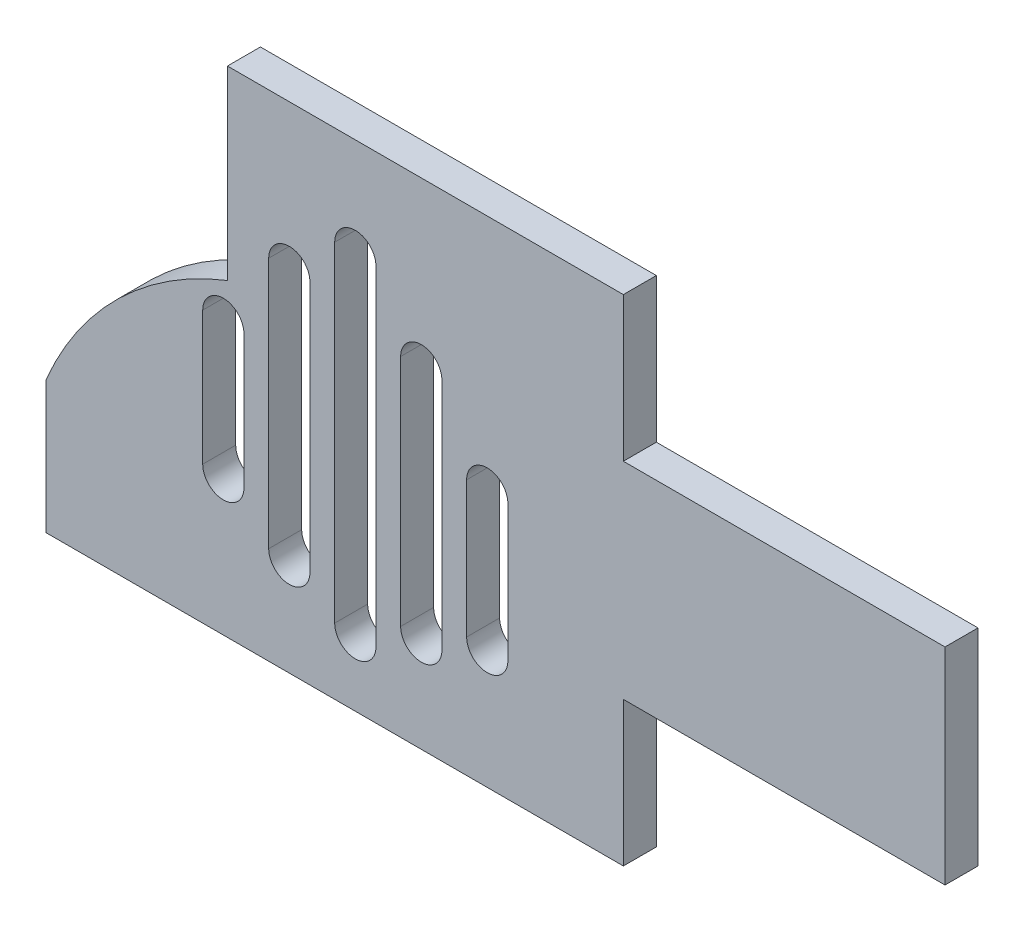
ISO-10303-21;
HEADER;
FILE_DESCRIPTION(('STEP AP214'),'2;1');
FILE_NAME('part.step','',(''),(''),'','','');
FILE_SCHEMA(('AUTOMOTIVE_DESIGN { 1 0 10303 214 1 1 1 1 }'));
ENDSEC;
DATA;
#1=APPLICATION_CONTEXT('core data for automotive mechanical design processes');
#2=APPLICATION_PROTOCOL_DEFINITION('international standard','automotive_design',2000,#1);
#3=PRODUCT_CONTEXT('',#1,'mechanical');
#4=PRODUCT('Part','Part','',(#3));
#5=PRODUCT_RELATED_PRODUCT_CATEGORY('part','',(#4));
#6=PRODUCT_DEFINITION_FORMATION('','',#4);
#7=PRODUCT_DEFINITION_CONTEXT('part definition',#1,'design');
#8=PRODUCT_DEFINITION('design','',#6,#7);
#9=PRODUCT_DEFINITION_SHAPE('','',#8);
#10=(LENGTH_UNIT() NAMED_UNIT(*) SI_UNIT(.MILLI.,.METRE.));
#11=(NAMED_UNIT(*) PLANE_ANGLE_UNIT() SI_UNIT($,.RADIAN.));
#12=(NAMED_UNIT(*) SI_UNIT($,.STERADIAN.) SOLID_ANGLE_UNIT());
#13=UNCERTAINTY_MEASURE_WITH_UNIT(LENGTH_MEASURE(1.E-05),#10,'distance_accuracy_value','');
#14=(GEOMETRIC_REPRESENTATION_CONTEXT(3) GLOBAL_UNCERTAINTY_ASSIGNED_CONTEXT((#13)) GLOBAL_UNIT_ASSIGNED_CONTEXT((#10,
#11,#12)) REPRESENTATION_CONTEXT('',''));
#15=CARTESIAN_POINT('',(0.,0.,0.));
#16=DIRECTION('',(0.,0.,1.));
#17=DIRECTION('',(1.,0.,0.));
#18=AXIS2_PLACEMENT_3D('',#15,#16,#17);
#19=CARTESIAN_POINT('',(-2.92778104034197,-8.11928736668815,4.));
#20=DIRECTION('',(0.,0.,1.));
#21=DIRECTION('',(1.,0.,0.));
#22=AXIS2_PLACEMENT_3D('',#19,#20,#21);
#23=PLANE('',#22);
#24=DIRECTION('',(1.,0.,0.));
#25=VECTOR('',#24,1.);
#26=CARTESIAN_POINT('',(30.8627181714712,-9.00594586937473,4.));
#27=LINE('',#26,#25);
#28=CARTESIAN_POINT('',(-39.1372818285288,-9.00594586937474,4.));
#29=VERTEX_POINT('',#28);
#30=CARTESIAN_POINT('',(30.8627181714712,-9.00594586937473,4.));
#31=VERTEX_POINT('',#30);
#32=EDGE_CURVE('E390',#29,#31,#27,.T.);
#33=ORIENTED_EDGE('',*,*,#32,.T.);
#34=DIRECTION('',(0.,1.,0.));
#35=VECTOR('',#34,1.);
#36=CARTESIAN_POINT('',(30.8627181714712,8.49405413062527,4.));
#37=LINE('',#36,#35);
#38=CARTESIAN_POINT('',(30.8627181714712,8.49405413062527,4.));
#39=VERTEX_POINT('',#38);
#40=EDGE_CURVE('E393',#31,#39,#37,.T.);
#41=ORIENTED_EDGE('',*,*,#40,.T.);
#42=DIRECTION('',(1.,0.,0.));
#43=VECTOR('',#42,1.);
#44=CARTESIAN_POINT('',(30.8627181714712,8.49405413062527,4.));
#45=LINE('',#44,#43);
#46=CARTESIAN_POINT('',(69.8627181714712,8.49405413062527,4.));
#47=VERTEX_POINT('',#46);
#48=EDGE_CURVE('E396',#39,#47,#45,.T.);
#49=ORIENTED_EDGE('',*,*,#48,.T.);
#50=DIRECTION('',(0.,1.,0.));
#51=VECTOR('',#50,1.);
#52=CARTESIAN_POINT('',(69.8627181714712,33.4940541306253,4.));
#53=LINE('',#52,#51);
#54=CARTESIAN_POINT('',(69.8627181714712,33.4940541306253,4.));
#55=VERTEX_POINT('',#54);
#56=EDGE_CURVE('E398',#47,#55,#53,.T.);
#57=ORIENTED_EDGE('',*,*,#56,.T.);
#58=DIRECTION('',(-1.,0.,0.));
#59=VECTOR('',#58,1.);
#60=CARTESIAN_POINT('',(30.8627181714712,33.4940541306253,4.));
#61=LINE('',#60,#59);
#62=CARTESIAN_POINT('',(30.8627181714712,33.4940541306253,4.));
#63=VERTEX_POINT('',#62);
#64=EDGE_CURVE('E400',#55,#63,#61,.T.);
#65=ORIENTED_EDGE('',*,*,#64,.T.);
#66=DIRECTION('',(0.,1.,0.));
#67=VECTOR('',#66,1.);
#68=CARTESIAN_POINT('',(30.8627181714712,50.9940541306253,4.));
#69=LINE('',#68,#67);
#70=CARTESIAN_POINT('',(30.8627181714712,50.9940541306253,4.));
#71=VERTEX_POINT('',#70);
#72=EDGE_CURVE('E402',#63,#71,#69,.T.);
#73=ORIENTED_EDGE('',*,*,#72,.T.);
#74=DIRECTION('',(-1.,0.,0.));
#75=VECTOR('',#74,1.);
#76=CARTESIAN_POINT('',(30.8627181714712,50.9940541306253,4.));
#77=LINE('',#76,#75);
#78=CARTESIAN_POINT('',(-17.1372818285288,50.9940541306253,4.));
#79=VERTEX_POINT('',#78);
#80=EDGE_CURVE('E404',#71,#79,#77,.T.);
#81=ORIENTED_EDGE('',*,*,#80,.T.);
#82=DIRECTION('',(0.,-1.,0.));
#83=VECTOR('',#82,1.);
#84=CARTESIAN_POINT('',(-17.1372818285288,50.9940541306253,4.));
#85=LINE('',#84,#83);
#86=CARTESIAN_POINT('',(-17.1372818285288,28.4723046370912,4.));
#87=VERTEX_POINT('',#86);
#88=EDGE_CURVE('E406',#79,#87,#85,.T.);
#89=ORIENTED_EDGE('',*,*,#88,.T.);
#90=CARTESIAN_POINT('',(-2.92778104034197,-8.11928736668815,4.));
#91=DIRECTION('',(0.,0.,1.));
#92=DIRECTION('',(1.,0.,0.));
#93=AXIS2_PLACEMENT_3D('',#90,#91,#92);
#94=CIRCLE('',#93,39.2537197985176);
#95=CARTESIAN_POINT('',(-39.1372818285288,7.03744614323513,4.));
#96=VERTEX_POINT('',#95);
#97=EDGE_CURVE('E408',#87,#96,#94,.T.);
#98=ORIENTED_EDGE('',*,*,#97,.T.);
#99=DIRECTION('',(0.,-1.,0.));
#100=VECTOR('',#99,1.);
#101=CARTESIAN_POINT('',(-39.1372818285288,7.03744614323513,4.));
#102=LINE('',#101,#100);
#103=EDGE_CURVE('E410',#96,#29,#102,.T.);
#104=ORIENTED_EDGE('',*,*,#103,.T.);
#105=EDGE_LOOP('',(#33,#41,#49,#57,#65,#73,#81,#89,#98,#104));
#106=FACE_BOUND('',#105,.T.);
#107=DIRECTION('',(0.,-1.,0.));
#108=VECTOR('',#107,1.);
#109=CARTESIAN_POINT('',(-4.13728182852882,38.9940541306252,4.));
#110=LINE('',#109,#108);
#111=CARTESIAN_POINT('',(-4.13728182852882,38.9940541306252,4.));
#112=VERTEX_POINT('',#111);
#113=CARTESIAN_POINT('',(-4.13728182852882,-1.00594586937475,4.));
#114=VERTEX_POINT('',#113);
#115=EDGE_CURVE('E361',#112,#114,#110,.T.);
#116=ORIENTED_EDGE('',*,*,#115,.F.);
#117=CARTESIAN_POINT('',(-1.63728182852882,38.9940541306252,4.));
#118=DIRECTION('',(0.,0.,1.));
#119=DIRECTION('',(-1.,0.,0.));
#120=AXIS2_PLACEMENT_3D('',#117,#118,#119);
#121=CIRCLE('',#120,2.5);
#122=CARTESIAN_POINT('',(0.862718171471179,38.9940541306252,4.));
#123=VERTEX_POINT('',#122);
#124=EDGE_CURVE('E359',#123,#112,#121,.T.);
#125=ORIENTED_EDGE('',*,*,#124,.F.);
#126=DIRECTION('',(0.,1.,0.));
#127=VECTOR('',#126,1.);
#128=CARTESIAN_POINT('',(0.862718171471179,38.9940541306252,4.));
#129=LINE('',#128,#127);
#130=CARTESIAN_POINT('',(0.862718171471179,-1.00594586937475,4.));
#131=VERTEX_POINT('',#130);
#132=EDGE_CURVE('E367',#131,#123,#129,.T.);
#133=ORIENTED_EDGE('',*,*,#132,.F.);
#134=CARTESIAN_POINT('',(-1.63728182852882,-1.00594586937475,4.));
#135=DIRECTION('',(0.,0.,1.));
#136=DIRECTION('',(-1.,0.,0.));
#137=AXIS2_PLACEMENT_3D('',#134,#135,#136);
#138=CIRCLE('',#137,2.5);
#139=EDGE_CURVE('E364',#114,#131,#138,.T.);
#140=ORIENTED_EDGE('',*,*,#139,.F.);
#141=EDGE_LOOP('',(#116,#125,#133,#140));
#142=FACE_BOUND('',#141,.T.);
#143=DIRECTION('',(0.,-1.,0.));
#144=VECTOR('',#143,1.);
#145=CARTESIAN_POINT('',(-12.1372818285288,33.3124319025332,4.));
#146=LINE('',#145,#144);
#147=CARTESIAN_POINT('',(-12.1372818285288,33.3124319025332,4.));
#148=VERTEX_POINT('',#147);
#149=CARTESIAN_POINT('',(-12.1372818285288,2.80982789630503,4.));
#150=VERTEX_POINT('',#149);
#151=EDGE_CURVE('E330',#148,#150,#146,.T.);
#152=ORIENTED_EDGE('',*,*,#151,.F.);
#153=CARTESIAN_POINT('',(-9.63728182852882,33.3124319025332,4.));
#154=DIRECTION('',(0.,0.,1.));
#155=DIRECTION('',(-1.,0.,0.));
#156=AXIS2_PLACEMENT_3D('',#153,#154,#155);
#157=CIRCLE('',#156,2.5);
#158=CARTESIAN_POINT('',(-7.13728182852882,33.3124319025332,4.));
#159=VERTEX_POINT('',#158);
#160=EDGE_CURVE('E328',#159,#148,#157,.T.);
#161=ORIENTED_EDGE('',*,*,#160,.F.);
#162=DIRECTION('',(0.,1.,0.));
#163=VECTOR('',#162,1.);
#164=CARTESIAN_POINT('',(-7.13728182852882,33.3124319025332,4.));
#165=LINE('',#164,#163);
#166=CARTESIAN_POINT('',(-7.13728182852882,2.80982789630503,4.));
#167=VERTEX_POINT('',#166);
#168=EDGE_CURVE('E336',#167,#159,#165,.T.);
#169=ORIENTED_EDGE('',*,*,#168,.F.);
#170=CARTESIAN_POINT('',(-9.63728182852882,2.80982789630503,4.));
#171=DIRECTION('',(0.,0.,1.));
#172=DIRECTION('',(1.,0.,0.));
#173=AXIS2_PLACEMENT_3D('',#170,#171,#172);
#174=CIRCLE('',#173,2.5);
#175=EDGE_CURVE('E333',#150,#167,#174,.T.);
#176=ORIENTED_EDGE('',*,*,#175,.F.);
#177=EDGE_LOOP('',(#152,#161,#169,#176));
#178=FACE_BOUND('',#177,.T.);
#179=DIRECTION('',(0.,-1.,0.));
#180=VECTOR('',#179,1.);
#181=CARTESIAN_POINT('',(-20.1372818285288,23.8612835886495,4.));
#182=LINE('',#181,#180);
#183=CARTESIAN_POINT('',(-20.1372818285288,23.8612835886495,4.));
#184=VERTEX_POINT('',#183);
#185=CARTESIAN_POINT('',(-20.1372818285288,7.68344946237683,4.));
#186=VERTEX_POINT('',#185);
#187=EDGE_CURVE('E299',#184,#186,#182,.T.);
#188=ORIENTED_EDGE('',*,*,#187,.F.);
#189=CARTESIAN_POINT('',(-17.6372818285288,23.8612835886495,4.));
#190=DIRECTION('',(0.,0.,1.));
#191=DIRECTION('',(1.,0.,0.));
#192=AXIS2_PLACEMENT_3D('',#189,#190,#191);
#193=CIRCLE('',#192,2.5);
#194=CARTESIAN_POINT('',(-15.1372818285288,23.8612835886495,4.));
#195=VERTEX_POINT('',#194);
#196=EDGE_CURVE('E297',#195,#184,#193,.T.);
#197=ORIENTED_EDGE('',*,*,#196,.F.);
#198=DIRECTION('',(0.,1.,0.));
#199=VECTOR('',#198,1.);
#200=CARTESIAN_POINT('',(-15.1372818285288,23.8612835886495,4.));
#201=LINE('',#200,#199);
#202=CARTESIAN_POINT('',(-15.1372818285288,7.68344946237683,4.));
#203=VERTEX_POINT('',#202);
#204=EDGE_CURVE('E305',#203,#195,#201,.T.);
#205=ORIENTED_EDGE('',*,*,#204,.F.);
#206=CARTESIAN_POINT('',(-17.6372818285288,7.68344946237683,4.));
#207=DIRECTION('',(0.,0.,1.));
#208=DIRECTION('',(1.,0.,0.));
#209=AXIS2_PLACEMENT_3D('',#206,#207,#208);
#210=CIRCLE('',#209,2.5);
#211=EDGE_CURVE('E302',#186,#203,#210,.T.);
#212=ORIENTED_EDGE('',*,*,#211,.F.);
#213=EDGE_LOOP('',(#188,#197,#205,#212));
#214=FACE_BOUND('',#213,.T.);
#215=DIRECTION('',(0.,-1.,0.));
#216=VECTOR('',#215,1.);
#217=CARTESIAN_POINT('',(3.86271817147118,30.9940541306252,4.));
#218=LINE('',#217,#216);
#219=CARTESIAN_POINT('',(3.86271817147118,30.9940541306252,4.));
#220=VERTEX_POINT('',#219);
#221=CARTESIAN_POINT('',(3.86271817147118,2.64743444309961,4.));
#222=VERTEX_POINT('',#221);
#223=EDGE_CURVE('E268',#220,#222,#218,.T.);
#224=ORIENTED_EDGE('',*,*,#223,.F.);
#225=CARTESIAN_POINT('',(6.36271817147118,30.9940541306252,4.));
#226=DIRECTION('',(0.,0.,1.));
#227=DIRECTION('',(1.,0.,0.));
#228=AXIS2_PLACEMENT_3D('',#225,#226,#227);
#229=CIRCLE('',#228,2.5);
#230=CARTESIAN_POINT('',(8.86271817147118,30.9940541306252,4.));
#231=VERTEX_POINT('',#230);
#232=EDGE_CURVE('E266',#231,#220,#229,.T.);
#233=ORIENTED_EDGE('',*,*,#232,.F.);
#234=DIRECTION('',(0.,1.,0.));
#235=VECTOR('',#234,1.);
#236=CARTESIAN_POINT('',(8.86271817147118,30.9940541306252,4.));
#237=LINE('',#236,#235);
#238=CARTESIAN_POINT('',(8.86271817147118,2.64743444309961,4.));
#239=VERTEX_POINT('',#238);
#240=EDGE_CURVE('E274',#239,#231,#237,.T.);
#241=ORIENTED_EDGE('',*,*,#240,.F.);
#242=CARTESIAN_POINT('',(6.36271817147118,2.64743444309961,4.));
#243=DIRECTION('',(0.,0.,1.));
#244=DIRECTION('',(1.,0.,0.));
#245=AXIS2_PLACEMENT_3D('',#242,#243,#244);
#246=CIRCLE('',#245,2.5);
#247=EDGE_CURVE('E271',#222,#239,#246,.T.);
#248=ORIENTED_EDGE('',*,*,#247,.F.);
#249=EDGE_LOOP('',(#224,#233,#241,#248));
#250=FACE_BOUND('',#249,.T.);
#251=DIRECTION('',(0.,-1.,0.));
#252=VECTOR('',#251,1.);
#253=CARTESIAN_POINT('',(11.8627181714712,22.0482710062122,4.));
#254=LINE('',#253,#252);
#255=CARTESIAN_POINT('',(11.8627181714712,22.0482710062122,4.));
#256=VERTEX_POINT('',#255);
#257=CARTESIAN_POINT('',(11.8627181714712,5.53847301170768,4.));
#258=VERTEX_POINT('',#257);
#259=EDGE_CURVE('E238',#256,#258,#254,.T.);
#260=ORIENTED_EDGE('',*,*,#259,.F.);
#261=CARTESIAN_POINT('',(14.3627181714712,22.0482710062122,4.));
#262=DIRECTION('',(0.,0.,1.));
#263=DIRECTION('',(1.,0.,0.));
#264=AXIS2_PLACEMENT_3D('',#261,#262,#263);
#265=CIRCLE('',#264,2.5);
#266=CARTESIAN_POINT('',(16.8627181714712,22.0482710062122,4.));
#267=VERTEX_POINT('',#266);
#268=EDGE_CURVE('E230',#267,#256,#265,.T.);
#269=ORIENTED_EDGE('',*,*,#268,.F.);
#270=DIRECTION('',(0.,1.,0.));
#271=VECTOR('',#270,1.);
#272=CARTESIAN_POINT('',(16.8627181714712,22.0482710062122,4.));
#273=LINE('',#272,#271);
#274=CARTESIAN_POINT('',(16.8627181714712,5.53847301170768,4.));
#275=VERTEX_POINT('',#274);
#276=EDGE_CURVE('E252',#275,#267,#273,.T.);
#277=ORIENTED_EDGE('',*,*,#276,.F.);
#278=CARTESIAN_POINT('',(14.3627181714712,5.53847301170768,4.));
#279=DIRECTION('',(0.,0.,1.));
#280=DIRECTION('',(1.,0.,0.));
#281=AXIS2_PLACEMENT_3D('',#278,#279,#280);
#282=CIRCLE('',#281,2.5);
#283=EDGE_CURVE('E250',#258,#275,#282,.T.);
#284=ORIENTED_EDGE('',*,*,#283,.F.);
#285=EDGE_LOOP('',(#260,#269,#277,#284));
#286=FACE_BOUND('',#285,.T.);
#287=ADVANCED_FACE('F33',(#106,#142,#178,#214,#250,#286),#23,.T.);
#288=CARTESIAN_POINT('',(-2.92778104034197,-8.11928736668815,0.));
#289=DIRECTION('',(0.,0.,1.));
#290=DIRECTION('',(1.,0.,0.));
#291=AXIS2_PLACEMENT_3D('',#288,#289,#290);
#292=PLANE('',#291);
#293=CARTESIAN_POINT('',(6.36271817147118,30.9940541306252,0.));
#294=DIRECTION('',(0.,0.,1.));
#295=DIRECTION('',(1.,0.,0.));
#296=AXIS2_PLACEMENT_3D('',#293,#294,#295);
#297=CIRCLE('',#296,2.5);
#298=CARTESIAN_POINT('',(8.86271817147118,30.9940541306252,0.));
#299=VERTEX_POINT('',#298);
#300=CARTESIAN_POINT('',(3.86271817147118,30.9940541306252,0.));
#301=VERTEX_POINT('',#300);
#302=EDGE_CURVE('E246',#299,#301,#297,.T.);
#303=ORIENTED_EDGE('',*,*,#302,.T.);
#304=DIRECTION('',(0.,-1.,0.));
#305=VECTOR('',#304,1.);
#306=CARTESIAN_POINT('',(3.86271817147118,30.9940541306252,0.));
#307=LINE('',#306,#305);
#308=CARTESIAN_POINT('',(3.86271817147118,2.64743444309961,0.));
#309=VERTEX_POINT('',#308);
#310=EDGE_CURVE('E279',#301,#309,#307,.T.);
#311=ORIENTED_EDGE('',*,*,#310,.T.);
#312=CARTESIAN_POINT('',(6.36271817147118,2.64743444309961,0.));
#313=DIRECTION('',(0.,0.,1.));
#314=DIRECTION('',(1.,0.,0.));
#315=AXIS2_PLACEMENT_3D('',#312,#313,#314);
#316=CIRCLE('',#315,2.5);
#317=CARTESIAN_POINT('',(8.86271817147118,2.64743444309961,0.));
#318=VERTEX_POINT('',#317);
#319=EDGE_CURVE('E282',#309,#318,#316,.T.);
#320=ORIENTED_EDGE('',*,*,#319,.T.);
#321=DIRECTION('',(0.,1.,0.));
#322=VECTOR('',#321,1.);
#323=CARTESIAN_POINT('',(8.86271817147118,30.9940541306252,0.));
#324=LINE('',#323,#322);
#325=EDGE_CURVE('E269',#318,#299,#324,.T.);
#326=ORIENTED_EDGE('',*,*,#325,.T.);
#327=EDGE_LOOP('',(#303,#311,#320,#326));
#328=FACE_BOUND('',#327,.T.);
#329=CARTESIAN_POINT('',(-9.63728182852882,33.3124319025332,0.));
#330=DIRECTION('',(0.,0.,1.));
#331=DIRECTION('',(-1.,0.,0.));
#332=AXIS2_PLACEMENT_3D('',#329,#330,#331);
#333=CIRCLE('',#332,2.5);
#334=CARTESIAN_POINT('',(-7.13728182852882,33.3124319025332,0.));
#335=VERTEX_POINT('',#334);
#336=CARTESIAN_POINT('',(-12.1372818285288,33.3124319025332,0.));
#337=VERTEX_POINT('',#336);
#338=EDGE_CURVE('E327',#335,#337,#333,.T.);
#339=ORIENTED_EDGE('',*,*,#338,.T.);
#340=DIRECTION('',(0.,-1.,0.));
#341=VECTOR('',#340,1.);
#342=CARTESIAN_POINT('',(-12.1372818285288,33.3124319025332,0.));
#343=LINE('',#342,#341);
#344=CARTESIAN_POINT('',(-12.1372818285288,2.80982789630503,0.));
#345=VERTEX_POINT('',#344);
#346=EDGE_CURVE('E341',#337,#345,#343,.T.);
#347=ORIENTED_EDGE('',*,*,#346,.T.);
#348=CARTESIAN_POINT('',(-9.63728182852882,2.80982789630503,0.));
#349=DIRECTION('',(0.,0.,1.));
#350=DIRECTION('',(1.,0.,0.));
#351=AXIS2_PLACEMENT_3D('',#348,#349,#350);
#352=CIRCLE('',#351,2.5);
#353=CARTESIAN_POINT('',(-7.13728182852882,2.80982789630503,0.));
#354=VERTEX_POINT('',#353);
#355=EDGE_CURVE('E344',#345,#354,#352,.T.);
#356=ORIENTED_EDGE('',*,*,#355,.T.);
#357=DIRECTION('',(0.,1.,0.));
#358=VECTOR('',#357,1.);
#359=CARTESIAN_POINT('',(-7.13728182852882,33.3124319025332,0.));
#360=LINE('',#359,#358);
#361=EDGE_CURVE('E331',#354,#335,#360,.T.);
#362=ORIENTED_EDGE('',*,*,#361,.T.);
#363=EDGE_LOOP('',(#339,#347,#356,#362));
#364=FACE_BOUND('',#363,.T.);
#365=DIRECTION('',(1.,0.,0.));
#366=VECTOR('',#365,1.);
#367=CARTESIAN_POINT('',(30.8627181714712,-9.00594586937473,0.));
#368=LINE('',#367,#366);
#369=CARTESIAN_POINT('',(-39.1372818285288,-9.00594586937474,0.));
#370=VERTEX_POINT('',#369);
#371=CARTESIAN_POINT('',(30.8627181714712,-9.00594586937473,0.));
#372=VERTEX_POINT('',#371);
#373=EDGE_CURVE('E389',#370,#372,#368,.T.);
#374=ORIENTED_EDGE('',*,*,#373,.F.);
#375=DIRECTION('',(0.,-1.,0.));
#376=VECTOR('',#375,1.);
#377=CARTESIAN_POINT('',(-39.1372818285288,7.03744614323513,0.));
#378=LINE('',#377,#376);
#379=CARTESIAN_POINT('',(-39.1372818285288,7.03744614323513,0.));
#380=VERTEX_POINT('',#379);
#381=EDGE_CURVE('E394',#380,#370,#378,.T.);
#382=ORIENTED_EDGE('',*,*,#381,.F.);
#383=CARTESIAN_POINT('',(-2.92778104034197,-8.11928736668815,0.));
#384=DIRECTION('',(0.,0.,1.));
#385=DIRECTION('',(1.,0.,0.));
#386=AXIS2_PLACEMENT_3D('',#383,#384,#385);
#387=CIRCLE('',#386,39.2537197985176);
#388=CARTESIAN_POINT('',(-17.1372818285288,28.4723046370912,0.));
#389=VERTEX_POINT('',#388);
#390=EDGE_CURVE('E429',#389,#380,#387,.T.);
#391=ORIENTED_EDGE('',*,*,#390,.F.);
#392=DIRECTION('',(0.,-1.,0.));
#393=VECTOR('',#392,1.);
#394=CARTESIAN_POINT('',(-17.1372818285288,50.9940541306253,0.));
#395=LINE('',#394,#393);
#396=CARTESIAN_POINT('',(-17.1372818285288,50.9940541306253,0.));
#397=VERTEX_POINT('',#396);
#398=EDGE_CURVE('E427',#397,#389,#395,.T.);
#399=ORIENTED_EDGE('',*,*,#398,.F.);
#400=DIRECTION('',(-1.,0.,0.));
#401=VECTOR('',#400,1.);
#402=CARTESIAN_POINT('',(30.8627181714712,50.9940541306253,0.));
#403=LINE('',#402,#401);
#404=CARTESIAN_POINT('',(30.8627181714712,50.9940541306253,0.));
#405=VERTEX_POINT('',#404);
#406=EDGE_CURVE('E425',#405,#397,#403,.T.);
#407=ORIENTED_EDGE('',*,*,#406,.F.);
#408=DIRECTION('',(0.,1.,0.));
#409=VECTOR('',#408,1.);
#410=CARTESIAN_POINT('',(30.8627181714712,50.9940541306253,0.));
#411=LINE('',#410,#409);
#412=CARTESIAN_POINT('',(30.8627181714712,33.4940541306253,0.));
#413=VERTEX_POINT('',#412);
#414=EDGE_CURVE('E423',#413,#405,#411,.T.);
#415=ORIENTED_EDGE('',*,*,#414,.F.);
#416=DIRECTION('',(-1.,0.,0.));
#417=VECTOR('',#416,1.);
#418=CARTESIAN_POINT('',(30.8627181714712,33.4940541306253,0.));
#419=LINE('',#418,#417);
#420=CARTESIAN_POINT('',(69.8627181714712,33.4940541306253,0.));
#421=VERTEX_POINT('',#420);
#422=EDGE_CURVE('E421',#421,#413,#419,.T.);
#423=ORIENTED_EDGE('',*,*,#422,.F.);
#424=DIRECTION('',(0.,1.,0.));
#425=VECTOR('',#424,1.);
#426=CARTESIAN_POINT('',(69.8627181714712,33.4940541306253,0.));
#427=LINE('',#426,#425);
#428=CARTESIAN_POINT('',(69.8627181714712,8.49405413062527,0.));
#429=VERTEX_POINT('',#428);
#430=EDGE_CURVE('E419',#429,#421,#427,.T.);
#431=ORIENTED_EDGE('',*,*,#430,.F.);
#432=DIRECTION('',(1.,0.,0.));
#433=VECTOR('',#432,1.);
#434=CARTESIAN_POINT('',(30.8627181714712,8.49405413062527,0.));
#435=LINE('',#434,#433);
#436=CARTESIAN_POINT('',(30.8627181714712,8.49405413062527,0.));
#437=VERTEX_POINT('',#436);
#438=EDGE_CURVE('E417',#437,#429,#435,.T.);
#439=ORIENTED_EDGE('',*,*,#438,.F.);
#440=DIRECTION('',(0.,1.,0.));
#441=VECTOR('',#440,1.);
#442=CARTESIAN_POINT('',(30.8627181714712,8.49405413062527,0.));
#443=LINE('',#442,#441);
#444=EDGE_CURVE('E415',#372,#437,#443,.T.);
#445=ORIENTED_EDGE('',*,*,#444,.F.);
#446=EDGE_LOOP('',(#374,#382,#391,#399,#407,#415,#423,#431,#439,#445));
#447=FACE_BOUND('',#446,.T.);
#448=CARTESIAN_POINT('',(-1.63728182852882,38.9940541306252,0.));
#449=DIRECTION('',(0.,0.,1.));
#450=DIRECTION('',(-1.,0.,0.));
#451=AXIS2_PLACEMENT_3D('',#448,#449,#450);
#452=CIRCLE('',#451,2.5);
#453=CARTESIAN_POINT('',(0.862718171471179,38.9940541306252,0.));
#454=VERTEX_POINT('',#453);
#455=CARTESIAN_POINT('',(-4.13728182852882,38.9940541306252,0.));
#456=VERTEX_POINT('',#455);
#457=EDGE_CURVE('E358',#454,#456,#452,.T.);
#458=ORIENTED_EDGE('',*,*,#457,.T.);
#459=DIRECTION('',(0.,-1.,0.));
#460=VECTOR('',#459,1.);
#461=CARTESIAN_POINT('',(-4.13728182852882,38.9940541306252,0.));
#462=LINE('',#461,#460);
#463=CARTESIAN_POINT('',(-4.13728182852882,-1.00594586937475,0.));
#464=VERTEX_POINT('',#463);
#465=EDGE_CURVE('E372',#456,#464,#462,.T.);
#466=ORIENTED_EDGE('',*,*,#465,.T.);
#467=CARTESIAN_POINT('',(-1.63728182852882,-1.00594586937475,0.));
#468=DIRECTION('',(0.,0.,1.));
#469=DIRECTION('',(-1.,0.,0.));
#470=AXIS2_PLACEMENT_3D('',#467,#468,#469);
#471=CIRCLE('',#470,2.5);
#472=CARTESIAN_POINT('',(0.862718171471174,-1.00594586937475,0.));
#473=VERTEX_POINT('',#472);
#474=EDGE_CURVE('E375',#464,#473,#471,.T.);
#475=ORIENTED_EDGE('',*,*,#474,.T.);
#476=DIRECTION('',(0.,1.,0.));
#477=VECTOR('',#476,1.);
#478=CARTESIAN_POINT('',(0.862718171471179,38.9940541306252,0.));
#479=LINE('',#478,#477);
#480=EDGE_CURVE('E362',#473,#454,#479,.T.);
#481=ORIENTED_EDGE('',*,*,#480,.T.);
#482=EDGE_LOOP('',(#458,#466,#475,#481));
#483=FACE_BOUND('',#482,.T.);
#484=CARTESIAN_POINT('',(-17.6372818285288,23.8612835886495,0.));
#485=DIRECTION('',(0.,0.,1.));
#486=DIRECTION('',(1.,0.,0.));
#487=AXIS2_PLACEMENT_3D('',#484,#485,#486);
#488=CIRCLE('',#487,2.5);
#489=CARTESIAN_POINT('',(-15.1372818285288,23.8612835886495,0.));
#490=VERTEX_POINT('',#489);
#491=CARTESIAN_POINT('',(-20.1372818285288,23.8612835886495,0.));
#492=VERTEX_POINT('',#491);
#493=EDGE_CURVE('E296',#490,#492,#488,.T.);
#494=ORIENTED_EDGE('',*,*,#493,.T.);
#495=DIRECTION('',(0.,-1.,0.));
#496=VECTOR('',#495,1.);
#497=CARTESIAN_POINT('',(-20.1372818285288,23.8612835886495,0.));
#498=LINE('',#497,#496);
#499=CARTESIAN_POINT('',(-20.1372818285288,7.68344946237683,0.));
#500=VERTEX_POINT('',#499);
#501=EDGE_CURVE('E310',#492,#500,#498,.T.);
#502=ORIENTED_EDGE('',*,*,#501,.T.);
#503=CARTESIAN_POINT('',(-17.6372818285288,7.68344946237683,0.));
#504=DIRECTION('',(0.,0.,1.));
#505=DIRECTION('',(1.,0.,0.));
#506=AXIS2_PLACEMENT_3D('',#503,#504,#505);
#507=CIRCLE('',#506,2.5);
#508=CARTESIAN_POINT('',(-15.1372818285288,7.68344946237683,0.));
#509=VERTEX_POINT('',#508);
#510=EDGE_CURVE('E313',#500,#509,#507,.T.);
#511=ORIENTED_EDGE('',*,*,#510,.T.);
#512=DIRECTION('',(0.,1.,0.));
#513=VECTOR('',#512,1.);
#514=CARTESIAN_POINT('',(-15.1372818285288,23.8612835886495,0.));
#515=LINE('',#514,#513);
#516=EDGE_CURVE('E300',#509,#490,#515,.T.);
#517=ORIENTED_EDGE('',*,*,#516,.T.);
#518=EDGE_LOOP('',(#494,#502,#511,#517));
#519=FACE_BOUND('',#518,.T.);
#520=CARTESIAN_POINT('',(14.3627181714712,22.0482710062122,0.));
#521=DIRECTION('',(0.,0.,1.));
#522=DIRECTION('',(1.,0.,0.));
#523=AXIS2_PLACEMENT_3D('',#520,#521,#522);
#524=CIRCLE('',#523,2.5);
#525=CARTESIAN_POINT('',(16.8627181714712,22.0482710062122,0.));
#526=VERTEX_POINT('',#525);
#527=CARTESIAN_POINT('',(11.8627181714712,22.0482710062122,0.));
#528=VERTEX_POINT('',#527);
#529=EDGE_CURVE('E56',#526,#528,#524,.T.);
#530=ORIENTED_EDGE('',*,*,#529,.T.);
#531=DIRECTION('',(0.,-1.,0.));
#532=VECTOR('',#531,1.);
#533=CARTESIAN_POINT('',(11.8627181714712,22.0482710062122,0.));
#534=LINE('',#533,#532);
#535=CARTESIAN_POINT('',(11.8627181714712,5.53847301170768,0.));
#536=VERTEX_POINT('',#535);
#537=EDGE_CURVE('E245',#528,#536,#534,.T.);
#538=ORIENTED_EDGE('',*,*,#537,.T.);
#539=CARTESIAN_POINT('',(14.3627181714712,5.53847301170768,0.));
#540=DIRECTION('',(0.,0.,1.));
#541=DIRECTION('',(1.,0.,0.));
#542=AXIS2_PLACEMENT_3D('',#539,#540,#541);
#543=CIRCLE('',#542,2.5);
#544=CARTESIAN_POINT('',(16.8627181714712,5.53847301170768,0.));
#545=VERTEX_POINT('',#544);
#546=EDGE_CURVE('E258',#536,#545,#543,.T.);
#547=ORIENTED_EDGE('',*,*,#546,.T.);
#548=DIRECTION('',(0.,1.,0.));
#549=VECTOR('',#548,1.);
#550=CARTESIAN_POINT('',(16.8627181714712,22.0482710062122,0.));
#551=LINE('',#550,#549);
#552=EDGE_CURVE('E239',#545,#526,#551,.T.);
#553=ORIENTED_EDGE('',*,*,#552,.T.);
#554=EDGE_LOOP('',(#530,#538,#547,#553));
#555=FACE_BOUND('',#554,.T.);
#556=ADVANCED_FACE('F465',(#328,#364,#447,#483,#519,#555),#292,.F.);
#557=CARTESIAN_POINT('',(30.8627181714712,-9.00594586937473,4.));
#558=DIRECTION('',(0.,1.,0.));
#559=DIRECTION('',(-1.,0.,0.));
#560=AXIS2_PLACEMENT_3D('',#557,#558,#559);
#561=PLANE('',#560);
#562=ORIENTED_EDGE('',*,*,#373,.T.);
#563=DIRECTION('',(0.,0.,-1.));
#564=VECTOR('',#563,1.);
#565=CARTESIAN_POINT('',(30.8627181714712,-9.00594586937473,4.));
#566=LINE('',#565,#564);
#567=EDGE_CURVE('E11',#31,#372,#566,.T.);
#568=ORIENTED_EDGE('',*,*,#567,.F.);
#569=ORIENTED_EDGE('',*,*,#32,.F.);
#570=DIRECTION('',(0.,0.,-1.));
#571=VECTOR('',#570,1.);
#572=CARTESIAN_POINT('',(-39.1372818285288,-9.00594586937474,4.));
#573=LINE('',#572,#571);
#574=EDGE_CURVE('E412',#29,#370,#573,.T.);
#575=ORIENTED_EDGE('',*,*,#574,.T.);
#576=EDGE_LOOP('',(#562,#568,#569,#575));
#577=FACE_BOUND('',#576,.T.);
#578=ADVANCED_FACE('F35',(#577),#561,.F.);
#579=CARTESIAN_POINT('',(30.8627181714712,8.49405413062527,4.));
#580=DIRECTION('',(-1.,0.,0.));
#581=DIRECTION('',(0.,0.,1.));
#582=AXIS2_PLACEMENT_3D('',#579,#580,#581);
#583=PLANE('',#582);
#584=ORIENTED_EDGE('',*,*,#444,.T.);
#585=DIRECTION('',(0.,0.,-1.));
#586=VECTOR('',#585,1.);
#587=CARTESIAN_POINT('',(30.8627181714712,8.49405413062527,4.));
#588=LINE('',#587,#586);
#589=EDGE_CURVE('E41',#39,#437,#588,.T.);
#590=ORIENTED_EDGE('',*,*,#589,.F.);
#591=ORIENTED_EDGE('',*,*,#40,.F.);
#592=ORIENTED_EDGE('',*,*,#567,.T.);
#593=EDGE_LOOP('',(#584,#590,#591,#592));
#594=FACE_BOUND('',#593,.T.);
#595=ADVANCED_FACE('F483',(#594),#583,.F.);
#596=CARTESIAN_POINT('',(30.8627181714712,8.49405413062527,4.));
#597=DIRECTION('',(0.,1.,0.));
#598=DIRECTION('',(-1.,0.,0.));
#599=AXIS2_PLACEMENT_3D('',#596,#597,#598);
#600=PLANE('',#599);
#601=ORIENTED_EDGE('',*,*,#438,.T.);
#602=DIRECTION('',(0.,0.,-1.));
#603=VECTOR('',#602,1.);
#604=CARTESIAN_POINT('',(69.8627181714712,8.49405413062527,4.));
#605=LINE('',#604,#603);
#606=EDGE_CURVE('E452',#47,#429,#605,.T.);
#607=ORIENTED_EDGE('',*,*,#606,.F.);
#608=ORIENTED_EDGE('',*,*,#48,.F.);
#609=ORIENTED_EDGE('',*,*,#589,.T.);
#610=EDGE_LOOP('',(#601,#607,#608,#609));
#611=FACE_BOUND('',#610,.T.);
#612=ADVANCED_FACE('F459',(#611),#600,.F.);
#613=CARTESIAN_POINT('',(69.8627181714712,33.4940541306253,4.));
#614=DIRECTION('',(-1.,0.,0.));
#615=DIRECTION('',(0.,-1.,0.));
#616=AXIS2_PLACEMENT_3D('',#613,#614,#615);
#617=PLANE('',#616);
#618=ORIENTED_EDGE('',*,*,#430,.T.);
#619=DIRECTION('',(0.,0.,-1.));
#620=VECTOR('',#619,1.);
#621=CARTESIAN_POINT('',(69.8627181714712,33.4940541306253,4.));
#622=LINE('',#621,#620);
#623=EDGE_CURVE('E449',#55,#421,#622,.T.);
#624=ORIENTED_EDGE('',*,*,#623,.F.);
#625=ORIENTED_EDGE('',*,*,#56,.F.);
#626=ORIENTED_EDGE('',*,*,#606,.T.);
#627=EDGE_LOOP('',(#618,#624,#625,#626));
#628=FACE_BOUND('',#627,.T.);
#629=ADVANCED_FACE('F471',(#628),#617,.F.);
#630=CARTESIAN_POINT('',(30.8627181714712,33.4940541306253,4.));
#631=DIRECTION('',(0.,-1.,0.));
#632=DIRECTION('',(0.,0.,-1.));
#633=AXIS2_PLACEMENT_3D('',#630,#631,#632);
#634=PLANE('',#633);
#635=ORIENTED_EDGE('',*,*,#422,.T.);
#636=DIRECTION('',(0.,0.,-1.));
#637=VECTOR('',#636,1.);
#638=CARTESIAN_POINT('',(30.8627181714712,33.4940541306253,4.));
#639=LINE('',#638,#637);
#640=EDGE_CURVE('E446',#63,#413,#639,.T.);
#641=ORIENTED_EDGE('',*,*,#640,.F.);
#642=ORIENTED_EDGE('',*,*,#64,.F.);
#643=ORIENTED_EDGE('',*,*,#623,.T.);
#644=EDGE_LOOP('',(#635,#641,#642,#643));
#645=FACE_BOUND('',#644,.T.);
#646=ADVANCED_FACE('F475',(#645),#634,.F.);
#647=CARTESIAN_POINT('',(30.8627181714712,50.9940541306253,4.));
#648=DIRECTION('',(-1.,0.,0.));
#649=DIRECTION('',(0.,-1.,0.));
#650=AXIS2_PLACEMENT_3D('',#647,#648,#649);
#651=PLANE('',#650);
#652=ORIENTED_EDGE('',*,*,#414,.T.);
#653=DIRECTION('',(0.,0.,-1.));
#654=VECTOR('',#653,1.);
#655=CARTESIAN_POINT('',(30.8627181714712,50.9940541306253,4.));
#656=LINE('',#655,#654);
#657=EDGE_CURVE('E443',#71,#405,#656,.T.);
#658=ORIENTED_EDGE('',*,*,#657,.F.);
#659=ORIENTED_EDGE('',*,*,#72,.F.);
#660=ORIENTED_EDGE('',*,*,#640,.T.);
#661=EDGE_LOOP('',(#652,#658,#659,#660));
#662=FACE_BOUND('',#661,.T.);
#663=ADVANCED_FACE('F506',(#662),#651,.F.);
#664=CARTESIAN_POINT('',(30.8627181714712,50.9940541306253,4.));
#665=DIRECTION('',(0.,-1.,0.));
#666=DIRECTION('',(1.,0.,0.));
#667=AXIS2_PLACEMENT_3D('',#664,#665,#666);
#668=PLANE('',#667);
#669=ORIENTED_EDGE('',*,*,#406,.T.);
#670=DIRECTION('',(0.,0.,-1.));
#671=VECTOR('',#670,1.);
#672=CARTESIAN_POINT('',(-17.1372818285288,50.9940541306253,4.));
#673=LINE('',#672,#671);
#674=EDGE_CURVE('E440',#79,#397,#673,.T.);
#675=ORIENTED_EDGE('',*,*,#674,.F.);
#676=ORIENTED_EDGE('',*,*,#80,.F.);
#677=ORIENTED_EDGE('',*,*,#657,.T.);
#678=EDGE_LOOP('',(#669,#675,#676,#677));
#679=FACE_BOUND('',#678,.T.);
#680=ADVANCED_FACE('F503',(#679),#668,.F.);
#681=CARTESIAN_POINT('',(-17.1372818285288,50.9940541306253,4.));
#682=DIRECTION('',(1.,0.,0.));
#683=DIRECTION('',(0.,1.,0.));
#684=AXIS2_PLACEMENT_3D('',#681,#682,#683);
#685=PLANE('',#684);
#686=ORIENTED_EDGE('',*,*,#398,.T.);
#687=DIRECTION('',(0.,0.,-1.));
#688=VECTOR('',#687,1.);
#689=CARTESIAN_POINT('',(-17.1372818285288,28.4723046370912,4.));
#690=LINE('',#689,#688);
#691=EDGE_CURVE('E437',#87,#389,#690,.T.);
#692=ORIENTED_EDGE('',*,*,#691,.F.);
#693=ORIENTED_EDGE('',*,*,#88,.F.);
#694=ORIENTED_EDGE('',*,*,#674,.T.);
#695=EDGE_LOOP('',(#686,#692,#693,#694));
#696=FACE_BOUND('',#695,.T.);
#697=ADVANCED_FACE('F499',(#696),#685,.F.);
#698=CARTESIAN_POINT('',(-2.92778104034197,-8.11928736668815,4.));
#699=DIRECTION('',(0.,0.,-1.));
#700=DIRECTION('',(-1.,0.,0.));
#701=AXIS2_PLACEMENT_3D('',#698,#699,#700);
#702=CYLINDRICAL_SURFACE('',#701,39.2537197985176);
#703=ORIENTED_EDGE('',*,*,#390,.T.);
#704=DIRECTION('',(0.,0.,-1.));
#705=VECTOR('',#704,1.);
#706=CARTESIAN_POINT('',(-39.1372818285288,7.03744614323513,4.));
#707=LINE('',#706,#705);
#708=EDGE_CURVE('E434',#96,#380,#707,.T.);
#709=ORIENTED_EDGE('',*,*,#708,.F.);
#710=ORIENTED_EDGE('',*,*,#97,.F.);
#711=ORIENTED_EDGE('',*,*,#691,.T.);
#712=EDGE_LOOP('',(#703,#709,#710,#711));
#713=FACE_BOUND('',#712,.T.);
#714=ADVANCED_FACE('F495',(#713),#702,.T.);
#715=CARTESIAN_POINT('',(-39.1372818285288,7.03744614323513,4.));
#716=DIRECTION('',(1.,0.,0.));
#717=DIRECTION('',(0.,1.,0.));
#718=AXIS2_PLACEMENT_3D('',#715,#716,#717);
#719=PLANE('',#718);
#720=ORIENTED_EDGE('',*,*,#381,.T.);
#721=ORIENTED_EDGE('',*,*,#574,.F.);
#722=ORIENTED_EDGE('',*,*,#103,.F.);
#723=ORIENTED_EDGE('',*,*,#708,.T.);
#724=EDGE_LOOP('',(#720,#721,#722,#723));
#725=FACE_BOUND('',#724,.T.);
#726=ADVANCED_FACE('F490',(#725),#719,.F.);
#727=CARTESIAN_POINT('',(-1.63728182852882,38.9940541306252,4.));
#728=DIRECTION('',(0.,0.,-1.));
#729=DIRECTION('',(-1.,0.,0.));
#730=AXIS2_PLACEMENT_3D('',#727,#728,#729);
#731=CYLINDRICAL_SURFACE('',#730,2.5);
#732=ORIENTED_EDGE('',*,*,#457,.F.);
#733=DIRECTION('',(0.,0.,-1.));
#734=VECTOR('',#733,1.);
#735=CARTESIAN_POINT('',(0.862718171471179,38.9940541306252,4.));
#736=LINE('',#735,#734);
#737=EDGE_CURVE('E369',#123,#454,#736,.T.);
#738=ORIENTED_EDGE('',*,*,#737,.F.);
#739=ORIENTED_EDGE('',*,*,#124,.T.);
#740=DIRECTION('',(0.,0.,-1.));
#741=VECTOR('',#740,1.);
#742=CARTESIAN_POINT('',(-4.13728182852882,38.9940541306252,4.));
#743=LINE('',#742,#741);
#744=EDGE_CURVE('E386',#112,#456,#743,.T.);
#745=ORIENTED_EDGE('',*,*,#744,.T.);
#746=EDGE_LOOP('',(#732,#738,#739,#745));
#747=FACE_BOUND('',#746,.T.);
#748=ADVANCED_FACE('F523',(#747),#731,.F.);
#749=CARTESIAN_POINT('',(-4.13728182852882,38.9940541306252,4.));
#750=DIRECTION('',(1.,0.,0.));
#751=DIRECTION('',(0.,1.,0.));
#752=AXIS2_PLACEMENT_3D('',#749,#750,#751);
#753=PLANE('',#752);
#754=ORIENTED_EDGE('',*,*,#465,.F.);
#755=ORIENTED_EDGE('',*,*,#744,.F.);
#756=ORIENTED_EDGE('',*,*,#115,.T.);
#757=DIRECTION('',(0.,0.,-1.));
#758=VECTOR('',#757,1.);
#759=CARTESIAN_POINT('',(-4.13728182852882,-1.00594586937475,4.));
#760=LINE('',#759,#758);
#761=EDGE_CURVE('E384',#114,#464,#760,.T.);
#762=ORIENTED_EDGE('',*,*,#761,.T.);
#763=EDGE_LOOP('',(#754,#755,#756,#762));
#764=FACE_BOUND('',#763,.T.);
#765=ADVANCED_FACE('F549',(#764),#753,.T.);
#766=CARTESIAN_POINT('',(-1.63728182852882,-1.00594586937475,4.));
#767=DIRECTION('',(0.,0.,-1.));
#768=DIRECTION('',(-1.,0.,0.));
#769=AXIS2_PLACEMENT_3D('',#766,#767,#768);
#770=CYLINDRICAL_SURFACE('',#769,2.5);
#771=ORIENTED_EDGE('',*,*,#474,.F.);
#772=ORIENTED_EDGE('',*,*,#761,.F.);
#773=ORIENTED_EDGE('',*,*,#139,.T.);
#774=DIRECTION('',(0.,0.,-1.));
#775=VECTOR('',#774,1.);
#776=CARTESIAN_POINT('',(0.862718171471174,-1.00594586937475,4.));
#777=LINE('',#776,#775);
#778=EDGE_CURVE('E382',#131,#473,#777,.T.);
#779=ORIENTED_EDGE('',*,*,#778,.T.);
#780=EDGE_LOOP('',(#771,#772,#773,#779));
#781=FACE_BOUND('',#780,.T.);
#782=ADVANCED_FACE('F556',(#781),#770,.F.);
#783=CARTESIAN_POINT('',(0.862718171471179,38.9940541306252,4.));
#784=DIRECTION('',(-1.,0.,0.));
#785=DIRECTION('',(0.,0.,1.));
#786=AXIS2_PLACEMENT_3D('',#783,#784,#785);
#787=PLANE('',#786);
#788=ORIENTED_EDGE('',*,*,#480,.F.);
#789=ORIENTED_EDGE('',*,*,#778,.F.);
#790=ORIENTED_EDGE('',*,*,#132,.T.);
#791=ORIENTED_EDGE('',*,*,#737,.T.);
#792=EDGE_LOOP('',(#788,#789,#790,#791));
#793=FACE_BOUND('',#792,.T.);
#794=ADVANCED_FACE('F563',(#793),#787,.T.);
#795=CARTESIAN_POINT('',(-9.63728182852882,33.3124319025332,4.));
#796=DIRECTION('',(0.,0.,-1.));
#797=DIRECTION('',(-1.,0.,0.));
#798=AXIS2_PLACEMENT_3D('',#795,#796,#797);
#799=CYLINDRICAL_SURFACE('',#798,2.5);
#800=ORIENTED_EDGE('',*,*,#338,.F.);
#801=DIRECTION('',(0.,0.,-1.));
#802=VECTOR('',#801,1.);
#803=CARTESIAN_POINT('',(-7.13728182852882,33.3124319025332,4.));
#804=LINE('',#803,#802);
#805=EDGE_CURVE('E338',#159,#335,#804,.T.);
#806=ORIENTED_EDGE('',*,*,#805,.F.);
#807=ORIENTED_EDGE('',*,*,#160,.T.);
#808=DIRECTION('',(0.,0.,-1.));
#809=VECTOR('',#808,1.);
#810=CARTESIAN_POINT('',(-12.1372818285288,33.3124319025332,4.));
#811=LINE('',#810,#809);
#812=EDGE_CURVE('E355',#148,#337,#811,.T.);
#813=ORIENTED_EDGE('',*,*,#812,.T.);
#814=EDGE_LOOP('',(#800,#806,#807,#813));
#815=FACE_BOUND('',#814,.T.);
#816=ADVANCED_FACE('F571',(#815),#799,.F.);
#817=CARTESIAN_POINT('',(-12.1372818285288,33.3124319025332,4.));
#818=DIRECTION('',(1.,0.,0.));
#819=DIRECTION('',(0.,1.,0.));
#820=AXIS2_PLACEMENT_3D('',#817,#818,#819);
#821=PLANE('',#820);
#822=ORIENTED_EDGE('',*,*,#346,.F.);
#823=ORIENTED_EDGE('',*,*,#812,.F.);
#824=ORIENTED_EDGE('',*,*,#151,.T.);
#825=DIRECTION('',(0.,0.,-1.));
#826=VECTOR('',#825,1.);
#827=CARTESIAN_POINT('',(-12.1372818285288,2.80982789630503,4.));
#828=LINE('',#827,#826);
#829=EDGE_CURVE('E353',#150,#345,#828,.T.);
#830=ORIENTED_EDGE('',*,*,#829,.T.);
#831=EDGE_LOOP('',(#822,#823,#824,#830));
#832=FACE_BOUND('',#831,.T.);
#833=ADVANCED_FACE('F579',(#832),#821,.T.);
#834=CARTESIAN_POINT('',(-9.63728182852882,2.80982789630503,4.));
#835=DIRECTION('',(0.,0.,-1.));
#836=DIRECTION('',(-1.,0.,0.));
#837=AXIS2_PLACEMENT_3D('',#834,#835,#836);
#838=CYLINDRICAL_SURFACE('',#837,2.5);
#839=ORIENTED_EDGE('',*,*,#355,.F.);
#840=ORIENTED_EDGE('',*,*,#829,.F.);
#841=ORIENTED_EDGE('',*,*,#175,.T.);
#842=DIRECTION('',(0.,0.,-1.));
#843=VECTOR('',#842,1.);
#844=CARTESIAN_POINT('',(-7.13728182852882,2.80982789630503,4.));
#845=LINE('',#844,#843);
#846=EDGE_CURVE('E351',#167,#354,#845,.T.);
#847=ORIENTED_EDGE('',*,*,#846,.T.);
#848=EDGE_LOOP('',(#839,#840,#841,#847));
#849=FACE_BOUND('',#848,.T.);
#850=ADVANCED_FACE('F587',(#849),#838,.F.);
#851=CARTESIAN_POINT('',(-7.13728182852882,33.3124319025332,4.));
#852=DIRECTION('',(-1.,0.,0.));
#853=DIRECTION('',(0.,-1.,0.));
#854=AXIS2_PLACEMENT_3D('',#851,#852,#853);
#855=PLANE('',#854);
#856=ORIENTED_EDGE('',*,*,#361,.F.);
#857=ORIENTED_EDGE('',*,*,#846,.F.);
#858=ORIENTED_EDGE('',*,*,#168,.T.);
#859=ORIENTED_EDGE('',*,*,#805,.T.);
#860=EDGE_LOOP('',(#856,#857,#858,#859));
#861=FACE_BOUND('',#860,.T.);
#862=ADVANCED_FACE('F595',(#861),#855,.T.);
#863=CARTESIAN_POINT('',(-17.6372818285288,23.8612835886495,4.));
#864=DIRECTION('',(0.,0.,-1.));
#865=DIRECTION('',(-1.,0.,0.));
#866=AXIS2_PLACEMENT_3D('',#863,#864,#865);
#867=CYLINDRICAL_SURFACE('',#866,2.5);
#868=ORIENTED_EDGE('',*,*,#493,.F.);
#869=DIRECTION('',(0.,0.,-1.));
#870=VECTOR('',#869,1.);
#871=CARTESIAN_POINT('',(-15.1372818285288,23.8612835886495,4.));
#872=LINE('',#871,#870);
#873=EDGE_CURVE('E307',#195,#490,#872,.T.);
#874=ORIENTED_EDGE('',*,*,#873,.F.);
#875=ORIENTED_EDGE('',*,*,#196,.T.);
#876=DIRECTION('',(0.,0.,-1.));
#877=VECTOR('',#876,1.);
#878=CARTESIAN_POINT('',(-20.1372818285288,23.8612835886495,4.));
#879=LINE('',#878,#877);
#880=EDGE_CURVE('E324',#184,#492,#879,.T.);
#881=ORIENTED_EDGE('',*,*,#880,.T.);
#882=EDGE_LOOP('',(#868,#874,#875,#881));
#883=FACE_BOUND('',#882,.T.);
#884=ADVANCED_FACE('F603',(#883),#867,.F.);
#885=CARTESIAN_POINT('',(-20.1372818285288,23.8612835886495,4.));
#886=DIRECTION('',(1.,0.,0.));
#887=DIRECTION('',(0.,0.,-1.));
#888=AXIS2_PLACEMENT_3D('',#885,#886,#887);
#889=PLANE('',#888);
#890=ORIENTED_EDGE('',*,*,#501,.F.);
#891=ORIENTED_EDGE('',*,*,#880,.F.);
#892=ORIENTED_EDGE('',*,*,#187,.T.);
#893=DIRECTION('',(0.,0.,-1.));
#894=VECTOR('',#893,1.);
#895=CARTESIAN_POINT('',(-20.1372818285288,7.68344946237683,4.));
#896=LINE('',#895,#894);
#897=EDGE_CURVE('E322',#186,#500,#896,.T.);
#898=ORIENTED_EDGE('',*,*,#897,.T.);
#899=EDGE_LOOP('',(#890,#891,#892,#898));
#900=FACE_BOUND('',#899,.T.);
#901=ADVANCED_FACE('F611',(#900),#889,.T.);
#902=CARTESIAN_POINT('',(-17.6372818285288,7.68344946237683,4.));
#903=DIRECTION('',(0.,0.,-1.));
#904=DIRECTION('',(-1.,0.,0.));
#905=AXIS2_PLACEMENT_3D('',#902,#903,#904);
#906=CYLINDRICAL_SURFACE('',#905,2.5);
#907=ORIENTED_EDGE('',*,*,#510,.F.);
#908=ORIENTED_EDGE('',*,*,#897,.F.);
#909=ORIENTED_EDGE('',*,*,#211,.T.);
#910=DIRECTION('',(0.,0.,-1.));
#911=VECTOR('',#910,1.);
#912=CARTESIAN_POINT('',(-15.1372818285288,7.68344946237683,4.));
#913=LINE('',#912,#911);
#914=EDGE_CURVE('E320',#203,#509,#913,.T.);
#915=ORIENTED_EDGE('',*,*,#914,.T.);
#916=EDGE_LOOP('',(#907,#908,#909,#915));
#917=FACE_BOUND('',#916,.T.);
#918=ADVANCED_FACE('F619',(#917),#906,.F.);
#919=CARTESIAN_POINT('',(-15.1372818285288,23.8612835886495,4.));
#920=DIRECTION('',(-1.,0.,0.));
#921=DIRECTION('',(0.,-1.,0.));
#922=AXIS2_PLACEMENT_3D('',#919,#920,#921);
#923=PLANE('',#922);
#924=ORIENTED_EDGE('',*,*,#516,.F.);
#925=ORIENTED_EDGE('',*,*,#914,.F.);
#926=ORIENTED_EDGE('',*,*,#204,.T.);
#927=ORIENTED_EDGE('',*,*,#873,.T.);
#928=EDGE_LOOP('',(#924,#925,#926,#927));
#929=FACE_BOUND('',#928,.T.);
#930=ADVANCED_FACE('F627',(#929),#923,.T.);
#931=CARTESIAN_POINT('',(6.36271817147118,30.9940541306252,4.));
#932=DIRECTION('',(0.,0.,-1.));
#933=DIRECTION('',(-1.,0.,0.));
#934=AXIS2_PLACEMENT_3D('',#931,#932,#933);
#935=CYLINDRICAL_SURFACE('',#934,2.5);
#936=ORIENTED_EDGE('',*,*,#302,.F.);
#937=DIRECTION('',(0.,0.,-1.));
#938=VECTOR('',#937,1.);
#939=CARTESIAN_POINT('',(8.86271817147118,30.9940541306252,4.));
#940=LINE('',#939,#938);
#941=EDGE_CURVE('E276',#231,#299,#940,.T.);
#942=ORIENTED_EDGE('',*,*,#941,.F.);
#943=ORIENTED_EDGE('',*,*,#232,.T.);
#944=DIRECTION('',(0.,0.,-1.));
#945=VECTOR('',#944,1.);
#946=CARTESIAN_POINT('',(3.86271817147118,30.9940541306252,4.));
#947=LINE('',#946,#945);
#948=EDGE_CURVE('E293',#220,#301,#947,.T.);
#949=ORIENTED_EDGE('',*,*,#948,.T.);
#950=EDGE_LOOP('',(#936,#942,#943,#949));
#951=FACE_BOUND('',#950,.T.);
#952=ADVANCED_FACE('F635',(#951),#935,.F.);
#953=CARTESIAN_POINT('',(3.86271817147118,30.9940541306252,4.));
#954=DIRECTION('',(1.,0.,0.));
#955=DIRECTION('',(0.,0.,-1.));
#956=AXIS2_PLACEMENT_3D('',#953,#954,#955);
#957=PLANE('',#956);
#958=ORIENTED_EDGE('',*,*,#310,.F.);
#959=ORIENTED_EDGE('',*,*,#948,.F.);
#960=ORIENTED_EDGE('',*,*,#223,.T.);
#961=DIRECTION('',(0.,0.,-1.));
#962=VECTOR('',#961,1.);
#963=CARTESIAN_POINT('',(3.86271817147118,2.64743444309961,4.));
#964=LINE('',#963,#962);
#965=EDGE_CURVE('E291',#222,#309,#964,.T.);
#966=ORIENTED_EDGE('',*,*,#965,.T.);
#967=EDGE_LOOP('',(#958,#959,#960,#966));
#968=FACE_BOUND('',#967,.T.);
#969=ADVANCED_FACE('F643',(#968),#957,.T.);
#970=CARTESIAN_POINT('',(6.36271817147118,2.64743444309961,4.));
#971=DIRECTION('',(0.,0.,-1.));
#972=DIRECTION('',(-1.,0.,0.));
#973=AXIS2_PLACEMENT_3D('',#970,#971,#972);
#974=CYLINDRICAL_SURFACE('',#973,2.5);
#975=ORIENTED_EDGE('',*,*,#319,.F.);
#976=ORIENTED_EDGE('',*,*,#965,.F.);
#977=ORIENTED_EDGE('',*,*,#247,.T.);
#978=DIRECTION('',(0.,0.,-1.));
#979=VECTOR('',#978,1.);
#980=CARTESIAN_POINT('',(8.86271817147118,2.64743444309961,4.));
#981=LINE('',#980,#979);
#982=EDGE_CURVE('E289',#239,#318,#981,.T.);
#983=ORIENTED_EDGE('',*,*,#982,.T.);
#984=EDGE_LOOP('',(#975,#976,#977,#983));
#985=FACE_BOUND('',#984,.T.);
#986=ADVANCED_FACE('F651',(#985),#974,.F.);
#987=CARTESIAN_POINT('',(8.86271817147118,30.9940541306252,4.));
#988=DIRECTION('',(-1.,0.,0.));
#989=DIRECTION('',(0.,0.,1.));
#990=AXIS2_PLACEMENT_3D('',#987,#988,#989);
#991=PLANE('',#990);
#992=ORIENTED_EDGE('',*,*,#325,.F.);
#993=ORIENTED_EDGE('',*,*,#982,.F.);
#994=ORIENTED_EDGE('',*,*,#240,.T.);
#995=ORIENTED_EDGE('',*,*,#941,.T.);
#996=EDGE_LOOP('',(#992,#993,#994,#995));
#997=FACE_BOUND('',#996,.T.);
#998=ADVANCED_FACE('F659',(#997),#991,.T.);
#999=CARTESIAN_POINT('',(14.3627181714712,22.0482710062122,4.));
#1000=DIRECTION('',(0.,0.,-1.));
#1001=DIRECTION('',(-1.,0.,0.));
#1002=AXIS2_PLACEMENT_3D('',#999,#1000,#1001);
#1003=CYLINDRICAL_SURFACE('',#1002,2.5);
#1004=ORIENTED_EDGE('',*,*,#529,.F.);
#1005=DIRECTION('',(0.,0.,-1.));
#1006=VECTOR('',#1005,1.);
#1007=CARTESIAN_POINT('',(16.8627181714712,22.0482710062122,4.));
#1008=LINE('',#1007,#1006);
#1009=EDGE_CURVE('E234',#267,#526,#1008,.T.);
#1010=ORIENTED_EDGE('',*,*,#1009,.F.);
#1011=ORIENTED_EDGE('',*,*,#268,.T.);
#1012=DIRECTION('',(0.,0.,-1.));
#1013=VECTOR('',#1012,1.);
#1014=CARTESIAN_POINT('',(11.8627181714712,22.0482710062122,4.));
#1015=LINE('',#1014,#1013);
#1016=EDGE_CURVE('E233',#256,#528,#1015,.T.);
#1017=ORIENTED_EDGE('',*,*,#1016,.T.);
#1018=EDGE_LOOP('',(#1004,#1010,#1011,#1017));
#1019=FACE_BOUND('',#1018,.T.);
#1020=ADVANCED_FACE('F232',(#1019),#1003,.F.);
#1021=CARTESIAN_POINT('',(11.8627181714712,22.0482710062122,4.));
#1022=DIRECTION('',(1.,0.,0.));
#1023=DIRECTION('',(0.,0.,-1.));
#1024=AXIS2_PLACEMENT_3D('',#1021,#1022,#1023);
#1025=PLANE('',#1024);
#1026=ORIENTED_EDGE('',*,*,#537,.F.);
#1027=ORIENTED_EDGE('',*,*,#1016,.F.);
#1028=ORIENTED_EDGE('',*,*,#259,.T.);
#1029=DIRECTION('',(0.,0.,-1.));
#1030=VECTOR('',#1029,1.);
#1031=CARTESIAN_POINT('',(11.8627181714712,5.53847301170768,4.));
#1032=LINE('',#1031,#1030);
#1033=EDGE_CURVE('E247',#258,#536,#1032,.T.);
#1034=ORIENTED_EDGE('',*,*,#1033,.T.);
#1035=EDGE_LOOP('',(#1026,#1027,#1028,#1034));
#1036=FACE_BOUND('',#1035,.T.);
#1037=ADVANCED_FACE('F242',(#1036),#1025,.T.);
#1038=CARTESIAN_POINT('',(14.3627181714712,5.53847301170768,4.));
#1039=DIRECTION('',(0.,0.,-1.));
#1040=DIRECTION('',(-1.,0.,0.));
#1041=AXIS2_PLACEMENT_3D('',#1038,#1039,#1040);
#1042=CYLINDRICAL_SURFACE('',#1041,2.5);
#1043=ORIENTED_EDGE('',*,*,#546,.F.);
#1044=ORIENTED_EDGE('',*,*,#1033,.F.);
#1045=ORIENTED_EDGE('',*,*,#283,.T.);
#1046=DIRECTION('',(0.,0.,-1.));
#1047=VECTOR('',#1046,1.);
#1048=CARTESIAN_POINT('',(16.8627181714712,5.53847301170768,4.));
#1049=LINE('',#1048,#1047);
#1050=EDGE_CURVE('E48',#275,#545,#1049,.T.);
#1051=ORIENTED_EDGE('',*,*,#1050,.T.);
#1052=EDGE_LOOP('',(#1043,#1044,#1045,#1051));
#1053=FACE_BOUND('',#1052,.T.);
#1054=ADVANCED_FACE('F680',(#1053),#1042,.F.);
#1055=CARTESIAN_POINT('',(16.8627181714712,22.0482710062122,4.));
#1056=DIRECTION('',(-1.,0.,0.));
#1057=DIRECTION('',(0.,0.,1.));
#1058=AXIS2_PLACEMENT_3D('',#1055,#1056,#1057);
#1059=PLANE('',#1058);
#1060=ORIENTED_EDGE('',*,*,#552,.F.);
#1061=ORIENTED_EDGE('',*,*,#1050,.F.);
#1062=ORIENTED_EDGE('',*,*,#276,.T.);
#1063=ORIENTED_EDGE('',*,*,#1009,.T.);
#1064=EDGE_LOOP('',(#1060,#1061,#1062,#1063));
#1065=FACE_BOUND('',#1064,.T.);
#1066=ADVANCED_FACE('F687',(#1065),#1059,.T.);
#1067=CLOSED_SHELL('',(#287,#556,#578,#595,#612,#629,#646,#663,#680,#697,#714,#726,#748,#765,
#782,#794,#816,#833,#850,#862,#884,#901,#918,#930,#952,#969,#986,#998,#1020,#1037,#1054,#1066));
#1068=MANIFOLD_SOLID_BREP('B2',#1067);
#1069=ADVANCED_BREP_SHAPE_REPRESENTATION('',(#18,#1068),#14);
#1070=SHAPE_DEFINITION_REPRESENTATION(#9,#1069);
ENDSEC;
END-ISO-10303-21;
